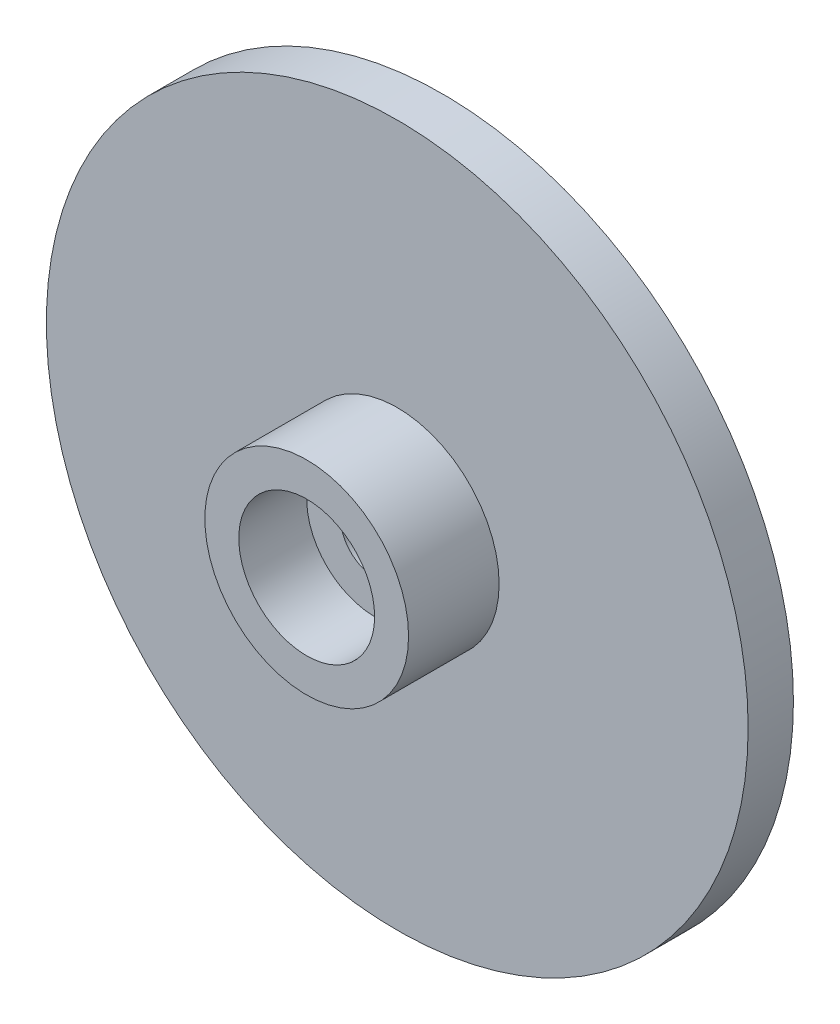
ISO-10303-21;
HEADER;
FILE_DESCRIPTION(('STEP AP214'),'2;1');
FILE_NAME('part.step','',(''),(''),'','','');
FILE_SCHEMA(('AUTOMOTIVE_DESIGN { 1 0 10303 214 1 1 1 1 }'));
ENDSEC;
DATA;
#1=APPLICATION_CONTEXT('core data for automotive mechanical design processes');
#2=APPLICATION_PROTOCOL_DEFINITION('international standard','automotive_design',2000,#1);
#3=PRODUCT_CONTEXT('',#1,'mechanical');
#4=PRODUCT('Part','Part','',(#3));
#5=PRODUCT_RELATED_PRODUCT_CATEGORY('part','',(#4));
#6=PRODUCT_DEFINITION_FORMATION('','',#4);
#7=PRODUCT_DEFINITION_CONTEXT('part definition',#1,'design');
#8=PRODUCT_DEFINITION('design','',#6,#7);
#9=PRODUCT_DEFINITION_SHAPE('','',#8);
#10=(LENGTH_UNIT() NAMED_UNIT(*) SI_UNIT(.MILLI.,.METRE.));
#11=(NAMED_UNIT(*) PLANE_ANGLE_UNIT() SI_UNIT($,.RADIAN.));
#12=(NAMED_UNIT(*) SI_UNIT($,.STERADIAN.) SOLID_ANGLE_UNIT());
#13=UNCERTAINTY_MEASURE_WITH_UNIT(LENGTH_MEASURE(1.E-05),#10,'distance_accuracy_value','');
#14=(GEOMETRIC_REPRESENTATION_CONTEXT(3) GLOBAL_UNCERTAINTY_ASSIGNED_CONTEXT((#13)) GLOBAL_UNIT_ASSIGNED_CONTEXT((#10,
#11,#12)) REPRESENTATION_CONTEXT('',''));
#15=CARTESIAN_POINT('',(0.,0.,0.));
#16=DIRECTION('',(0.,0.,1.));
#17=DIRECTION('',(1.,0.,0.));
#18=AXIS2_PLACEMENT_3D('',#15,#16,#17);
#19=CARTESIAN_POINT('',(0.,0.,2.));
#20=DIRECTION('',(0.,0.,1.));
#21=DIRECTION('',(1.,0.,0.));
#22=AXIS2_PLACEMENT_3D('',#19,#20,#21);
#23=PLANE('',#22);
#24=CARTESIAN_POINT('',(0.,0.,2.));
#25=DIRECTION('',(0.,0.,1.));
#26=DIRECTION('',(1.,0.,0.));
#27=AXIS2_PLACEMENT_3D('',#24,#25,#26);
#28=CIRCLE('',#27,15.5);
#29=CARTESIAN_POINT('',(15.5,0.,2.));
#30=VERTEX_POINT('',#29);
#31=EDGE_CURVE('E43',#30,#30,#28,.T.);
#32=ORIENTED_EDGE('',*,*,#31,.T.);
#33=EDGE_LOOP('',(#32));
#34=FACE_BOUND('',#33,.T.);
#35=CARTESIAN_POINT('',(0.,0.,2.));
#36=DIRECTION('',(0.,0.,1.));
#37=DIRECTION('',(1.,0.,0.));
#38=AXIS2_PLACEMENT_3D('',#35,#36,#37);
#39=CIRCLE('',#38,4.5);
#40=CARTESIAN_POINT('',(4.5,0.,2.));
#41=VERTEX_POINT('',#40);
#42=EDGE_CURVE('E54',#41,#41,#39,.T.);
#43=ORIENTED_EDGE('',*,*,#42,.F.);
#44=EDGE_LOOP('',(#43));
#45=FACE_BOUND('',#44,.T.);
#46=ADVANCED_FACE('F36',(#34,#45),#23,.T.);
#47=CARTESIAN_POINT('',(0.,0.,2.));
#48=DIRECTION('',(0.,0.,-1.));
#49=DIRECTION('',(-1.,0.,0.));
#50=AXIS2_PLACEMENT_3D('',#47,#48,#49);
#51=CYLINDRICAL_SURFACE('',#50,15.5);
#52=ORIENTED_EDGE('',*,*,#31,.F.);
#53=EDGE_LOOP('',(#52));
#54=FACE_BOUND('',#53,.T.);
#55=CARTESIAN_POINT('',(0.,0.,0.));
#56=DIRECTION('',(0.,0.,1.));
#57=DIRECTION('',(1.,0.,0.));
#58=AXIS2_PLACEMENT_3D('',#55,#56,#57);
#59=CIRCLE('',#58,15.5);
#60=CARTESIAN_POINT('',(15.5,0.,0.));
#61=VERTEX_POINT('',#60);
#62=EDGE_CURVE('E47',#61,#61,#59,.T.);
#63=ORIENTED_EDGE('',*,*,#62,.T.);
#64=EDGE_LOOP('',(#63));
#65=FACE_BOUND('',#64,.T.);
#66=ADVANCED_FACE('F38',(#54,#65),#51,.T.);
#67=CARTESIAN_POINT('',(0.,0.,0.));
#68=DIRECTION('',(0.,0.,1.));
#69=DIRECTION('',(1.,0.,0.));
#70=AXIS2_PLACEMENT_3D('',#67,#68,#69);
#71=PLANE('',#70);
#72=CARTESIAN_POINT('',(0.,0.,0.));
#73=DIRECTION('',(0.,0.,-1.));
#74=DIRECTION('',(-1.,0.,0.));
#75=AXIS2_PLACEMENT_3D('',#72,#73,#74);
#76=CIRCLE('',#75,4.5);
#77=CARTESIAN_POINT('',(-4.5,0.,0.));
#78=VERTEX_POINT('',#77);
#79=EDGE_CURVE('E69',#78,#78,#76,.T.);
#80=ORIENTED_EDGE('',*,*,#79,.F.);
#81=EDGE_LOOP('',(#80));
#82=FACE_BOUND('',#81,.T.);
#83=ORIENTED_EDGE('',*,*,#62,.F.);
#84=EDGE_LOOP('',(#83));
#85=FACE_BOUND('',#84,.T.);
#86=ADVANCED_FACE('F105',(#82,#85),#71,.F.);
#87=CARTESIAN_POINT('',(0.,0.,6.));
#88=DIRECTION('',(0.,0.,1.));
#89=DIRECTION('',(1.,0.,0.));
#90=AXIS2_PLACEMENT_3D('',#87,#88,#89);
#91=PLANE('',#90);
#92=CARTESIAN_POINT('',(0.,0.,6.));
#93=DIRECTION('',(0.,0.,1.));
#94=DIRECTION('',(1.,0.,0.));
#95=AXIS2_PLACEMENT_3D('',#92,#93,#94);
#96=CIRCLE('',#95,4.5);
#97=CARTESIAN_POINT('',(4.5,0.,6.));
#98=VERTEX_POINT('',#97);
#99=EDGE_CURVE('E52',#98,#98,#96,.T.);
#100=ORIENTED_EDGE('',*,*,#99,.T.);
#101=EDGE_LOOP('',(#100));
#102=FACE_BOUND('',#101,.T.);
#103=CARTESIAN_POINT('',(0.,0.,6.));
#104=DIRECTION('',(0.,0.,1.));
#105=DIRECTION('',(1.,0.,0.));
#106=AXIS2_PLACEMENT_3D('',#103,#104,#105);
#107=CIRCLE('',#106,3.);
#108=CARTESIAN_POINT('',(3.,0.,6.));
#109=VERTEX_POINT('',#108);
#110=EDGE_CURVE('E57',#109,#109,#107,.T.);
#111=ORIENTED_EDGE('',*,*,#110,.F.);
#112=EDGE_LOOP('',(#111));
#113=FACE_BOUND('',#112,.T.);
#114=ADVANCED_FACE('F134',(#102,#113),#91,.T.);
#115=CARTESIAN_POINT('',(0.,0.,6.));
#116=DIRECTION('',(0.,0.,-1.));
#117=DIRECTION('',(-1.,0.,0.));
#118=AXIS2_PLACEMENT_3D('',#115,#116,#117);
#119=CYLINDRICAL_SURFACE('',#118,4.5);
#120=ORIENTED_EDGE('',*,*,#99,.F.);
#121=EDGE_LOOP('',(#120));
#122=FACE_BOUND('',#121,.T.);
#123=ORIENTED_EDGE('',*,*,#42,.T.);
#124=EDGE_LOOP('',(#123));
#125=FACE_BOUND('',#124,.T.);
#126=ADVANCED_FACE('F131',(#122,#125),#119,.T.);
#127=CARTESIAN_POINT('',(0.,0.,6.));
#128=DIRECTION('',(0.,0.,-1.));
#129=DIRECTION('',(-1.,0.,0.));
#130=AXIS2_PLACEMENT_3D('',#127,#128,#129);
#131=CYLINDRICAL_SURFACE('',#130,3.);
#132=CARTESIAN_POINT('',(0.,0.,3.));
#133=DIRECTION('',(0.,0.,1.));
#134=DIRECTION('',(1.,0.,0.));
#135=AXIS2_PLACEMENT_3D('',#132,#133,#134);
#136=CIRCLE('',#135,3.);
#137=CARTESIAN_POINT('',(3.,0.,3.));
#138=VERTEX_POINT('',#137);
#139=EDGE_CURVE('E11',#138,#138,#136,.T.);
#140=ORIENTED_EDGE('',*,*,#139,.F.);
#141=EDGE_LOOP('',(#140));
#142=FACE_BOUND('',#141,.T.);
#143=ORIENTED_EDGE('',*,*,#110,.T.);
#144=EDGE_LOOP('',(#143));
#145=FACE_BOUND('',#144,.T.);
#146=ADVANCED_FACE('F120',(#142,#145),#131,.F.);
#147=CARTESIAN_POINT('',(0.,0.,3.));
#148=DIRECTION('',(0.,0.,1.));
#149=DIRECTION('',(1.,0.,0.));
#150=AXIS2_PLACEMENT_3D('',#147,#148,#149);
#151=PLANE('',#150);
#152=CARTESIAN_POINT('',(0.,0.,3.));
#153=DIRECTION('',(0.,0.,1.));
#154=DIRECTION('',(1.,0.,0.));
#155=AXIS2_PLACEMENT_3D('',#152,#153,#154);
#156=CIRCLE('',#155,1.5);
#157=CARTESIAN_POINT('',(1.5,0.,3.));
#158=VERTEX_POINT('',#157);
#159=EDGE_CURVE('E76',#158,#158,#156,.T.);
#160=ORIENTED_EDGE('',*,*,#159,.F.);
#161=EDGE_LOOP('',(#160));
#162=FACE_BOUND('',#161,.T.);
#163=ORIENTED_EDGE('',*,*,#139,.T.);
#164=EDGE_LOOP('',(#163));
#165=FACE_BOUND('',#164,.T.);
#166=ADVANCED_FACE('F111',(#162,#165),#151,.T.);
#167=CARTESIAN_POINT('',(0.,0.,1.));
#168=DIRECTION('',(0.,0.,-1.));
#169=DIRECTION('',(-1.,0.,0.));
#170=AXIS2_PLACEMENT_3D('',#167,#168,#169);
#171=CYLINDRICAL_SURFACE('',#170,3.5);
#172=CARTESIAN_POINT('',(0.,0.,1.));
#173=DIRECTION('',(0.,0.,-1.));
#174=DIRECTION('',(-1.,0.,0.));
#175=AXIS2_PLACEMENT_3D('',#172,#173,#174);
#176=CIRCLE('',#175,3.5);
#177=CARTESIAN_POINT('',(-3.5,0.,1.));
#178=VERTEX_POINT('',#177);
#179=EDGE_CURVE('E72',#178,#178,#176,.T.);
#180=ORIENTED_EDGE('',*,*,#179,.T.);
#181=EDGE_LOOP('',(#180));
#182=FACE_BOUND('',#181,.T.);
#183=CARTESIAN_POINT('',(0.,0.,0.));
#184=DIRECTION('',(0.,0.,-1.));
#185=DIRECTION('',(-1.,0.,0.));
#186=AXIS2_PLACEMENT_3D('',#183,#184,#185);
#187=CIRCLE('',#186,3.5);
#188=CARTESIAN_POINT('',(-3.5,0.,0.));
#189=VERTEX_POINT('',#188);
#190=EDGE_CURVE('E73',#189,#189,#187,.T.);
#191=ORIENTED_EDGE('',*,*,#190,.F.);
#192=EDGE_LOOP('',(#191));
#193=FACE_BOUND('',#192,.T.);
#194=ADVANCED_FACE('F108',(#182,#193),#171,.T.);
#195=CARTESIAN_POINT('',(0.,0.,1.));
#196=DIRECTION('',(0.,0.,-1.));
#197=DIRECTION('',(-1.,0.,0.));
#198=AXIS2_PLACEMENT_3D('',#195,#196,#197);
#199=CYLINDRICAL_SURFACE('',#198,4.5);
#200=CARTESIAN_POINT('',(0.,0.,1.));
#201=DIRECTION('',(0.,0.,-1.));
#202=DIRECTION('',(-1.,0.,0.));
#203=AXIS2_PLACEMENT_3D('',#200,#201,#202);
#204=CIRCLE('',#203,4.5);
#205=CARTESIAN_POINT('',(-4.5,0.,1.));
#206=VERTEX_POINT('',#205);
#207=EDGE_CURVE('E66',#206,#206,#204,.T.);
#208=ORIENTED_EDGE('',*,*,#207,.F.);
#209=EDGE_LOOP('',(#208));
#210=FACE_BOUND('',#209,.T.);
#211=ORIENTED_EDGE('',*,*,#79,.T.);
#212=EDGE_LOOP('',(#211));
#213=FACE_BOUND('',#212,.T.);
#214=ADVANCED_FACE('F110',(#210,#213),#199,.F.);
#215=CARTESIAN_POINT('',(0.,0.,1.));
#216=DIRECTION('',(0.,0.,-1.));
#217=DIRECTION('',(-1.,0.,0.));
#218=AXIS2_PLACEMENT_3D('',#215,#216,#217);
#219=PLANE('',#218);
#220=ORIENTED_EDGE('',*,*,#179,.F.);
#221=EDGE_LOOP('',(#220));
#222=FACE_BOUND('',#221,.T.);
#223=ORIENTED_EDGE('',*,*,#207,.T.);
#224=EDGE_LOOP('',(#223));
#225=FACE_BOUND('',#224,.T.);
#226=ADVANCED_FACE('F93',(#222,#225),#219,.T.);
#227=CARTESIAN_POINT('',(0.,0.,1.));
#228=DIRECTION('',(0.,0.,-1.));
#229=DIRECTION('',(-1.,0.,0.));
#230=AXIS2_PLACEMENT_3D('',#227,#228,#229);
#231=PLANE('',#230);
#232=CARTESIAN_POINT('',(0.,0.,1.));
#233=DIRECTION('',(0.,0.,-1.));
#234=DIRECTION('',(-1.,0.,0.));
#235=AXIS2_PLACEMENT_3D('',#232,#233,#234);
#236=CIRCLE('',#235,1.5);
#237=CARTESIAN_POINT('',(-1.5,0.,1.));
#238=VERTEX_POINT('',#237);
#239=EDGE_CURVE('E83',#238,#238,#236,.T.);
#240=ORIENTED_EDGE('',*,*,#239,.F.);
#241=EDGE_LOOP('',(#240));
#242=FACE_BOUND('',#241,.T.);
#243=CARTESIAN_POINT('',(0.,0.,1.));
#244=DIRECTION('',(0.,0.,-1.));
#245=DIRECTION('',(-1.,0.,0.));
#246=AXIS2_PLACEMENT_3D('',#243,#244,#245);
#247=CIRCLE('',#246,3.);
#248=CARTESIAN_POINT('',(-3.,0.,1.));
#249=VERTEX_POINT('',#248);
#250=EDGE_CURVE('E62',#249,#249,#247,.T.);
#251=ORIENTED_EDGE('',*,*,#250,.T.);
#252=EDGE_LOOP('',(#251));
#253=FACE_BOUND('',#252,.T.);
#254=ADVANCED_FACE('F89',(#242,#253),#231,.T.);
#255=CARTESIAN_POINT('',(0.,0.,1.));
#256=DIRECTION('',(0.,0.,-1.));
#257=DIRECTION('',(-1.,0.,0.));
#258=AXIS2_PLACEMENT_3D('',#255,#256,#257);
#259=CYLINDRICAL_SURFACE('',#258,3.);
#260=ORIENTED_EDGE('',*,*,#250,.F.);
#261=EDGE_LOOP('',(#260));
#262=FACE_BOUND('',#261,.T.);
#263=CARTESIAN_POINT('',(0.,0.,0.));
#264=DIRECTION('',(0.,0.,-1.));
#265=DIRECTION('',(-1.,0.,0.));
#266=AXIS2_PLACEMENT_3D('',#263,#264,#265);
#267=CIRCLE('',#266,3.);
#268=CARTESIAN_POINT('',(-3.,0.,0.));
#269=VERTEX_POINT('',#268);
#270=EDGE_CURVE('E63',#269,#269,#267,.T.);
#271=ORIENTED_EDGE('',*,*,#270,.T.);
#272=EDGE_LOOP('',(#271));
#273=FACE_BOUND('',#272,.T.);
#274=ADVANCED_FACE('F92',(#262,#273),#259,.F.);
#275=ORIENTED_EDGE('',*,*,#270,.F.);
#276=EDGE_LOOP('',(#275));
#277=FACE_BOUND('',#276,.T.);
#278=ORIENTED_EDGE('',*,*,#190,.T.);
#279=EDGE_LOOP('',(#278));
#280=FACE_BOUND('',#279,.T.);
#281=ADVANCED_FACE('F99',(#277,#280),#71,.F.);
#282=CARTESIAN_POINT('',(0.,0.,13.));
#283=DIRECTION('',(0.,0.,-1.));
#284=DIRECTION('',(-1.,0.,0.));
#285=AXIS2_PLACEMENT_3D('',#282,#283,#284);
#286=CYLINDRICAL_SURFACE('',#285,1.5);
#287=ORIENTED_EDGE('',*,*,#159,.T.);
#288=EDGE_LOOP('',(#287));
#289=FACE_BOUND('',#288,.T.);
#290=ORIENTED_EDGE('',*,*,#239,.T.);
#291=EDGE_LOOP('',(#290));
#292=FACE_BOUND('',#291,.T.);
#293=ADVANCED_FACE('F87',(#289,#292),#286,.F.);
#294=CLOSED_SHELL('',(#46,#66,#86,#114,#126,#146,#166,#194,#214,#226,#254,#274,#281,#293));
#295=MANIFOLD_SOLID_BREP('B2',#294);
#296=ADVANCED_BREP_SHAPE_REPRESENTATION('',(#18,#295),#14);
#297=SHAPE_DEFINITION_REPRESENTATION(#9,#296);
ENDSEC;
END-ISO-10303-21;
